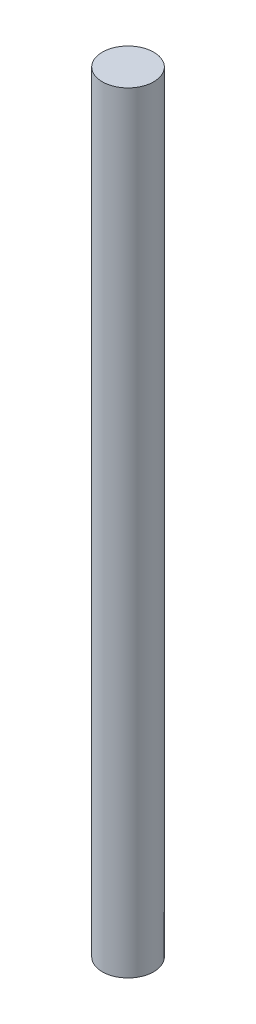
ISO-10303-21;
HEADER;
FILE_DESCRIPTION(('STEP AP214'),'2;1');
FILE_NAME('part.step','',(''),(''),'','','');
FILE_SCHEMA(('AUTOMOTIVE_DESIGN { 1 0 10303 214 1 1 1 1 }'));
ENDSEC;
DATA;
#1=APPLICATION_CONTEXT('core data for automotive mechanical design processes');
#2=APPLICATION_PROTOCOL_DEFINITION('international standard','automotive_design',2000,#1);
#3=PRODUCT_CONTEXT('',#1,'mechanical');
#4=PRODUCT('Part','Part','',(#3));
#5=PRODUCT_RELATED_PRODUCT_CATEGORY('part','',(#4));
#6=PRODUCT_DEFINITION_FORMATION('','',#4);
#7=PRODUCT_DEFINITION_CONTEXT('part definition',#1,'design');
#8=PRODUCT_DEFINITION('design','',#6,#7);
#9=PRODUCT_DEFINITION_SHAPE('','',#8);
#10=(LENGTH_UNIT() NAMED_UNIT(*) SI_UNIT(.MILLI.,.METRE.));
#11=(NAMED_UNIT(*) PLANE_ANGLE_UNIT() SI_UNIT($,.RADIAN.));
#12=(NAMED_UNIT(*) SI_UNIT($,.STERADIAN.) SOLID_ANGLE_UNIT());
#13=UNCERTAINTY_MEASURE_WITH_UNIT(LENGTH_MEASURE(1.E-05),#10,'distance_accuracy_value','');
#14=(GEOMETRIC_REPRESENTATION_CONTEXT(3) GLOBAL_UNCERTAINTY_ASSIGNED_CONTEXT((#13)) GLOBAL_UNIT_ASSIGNED_CONTEXT((#10,
#11,#12)) REPRESENTATION_CONTEXT('',''));
#15=CARTESIAN_POINT('',(0.,0.,0.));
#16=DIRECTION('',(0.,0.,1.));
#17=DIRECTION('',(1.,0.,0.));
#18=AXIS2_PLACEMENT_3D('',#15,#16,#17);
#19=CARTESIAN_POINT('',(0.,180.,0.));
#20=DIRECTION('',(0.,-1.,0.));
#21=DIRECTION('',(0.,0.,-1.));
#22=AXIS2_PLACEMENT_3D('',#19,#20,#21);
#23=CYLINDRICAL_SURFACE('',#22,6.);
#24=CARTESIAN_POINT('',(0.,180.,0.));
#25=DIRECTION('',(0.,1.,0.));
#26=DIRECTION('',(0.,0.,1.));
#27=AXIS2_PLACEMENT_3D('',#24,#25,#26);
#28=CIRCLE('',#27,6.);
#29=CARTESIAN_POINT('',(0.,180.,-6.));
#30=VERTEX_POINT('',#29);
#31=EDGE_CURVE('E10',#30,#30,#28,.T.);
#32=CARTESIAN_POINT('',(0.,0.,0.));
#33=DIRECTION('',(0.,1.,0.));
#34=DIRECTION('',(0.,0.,1.));
#35=AXIS2_PLACEMENT_3D('',#32,#33,#34);
#36=CIRCLE('',#35,6.);
#37=CARTESIAN_POINT('',(0.,0.,-6.));
#38=VERTEX_POINT('',#37);
#39=EDGE_CURVE('E40',#38,#38,#36,.T.);
#40=CARTESIAN_POINT('',(0.,180.,-6.));
#41=CARTESIAN_POINT('',(0.,178.125,-6.));
#42=CARTESIAN_POINT('',(0.,176.25,-6.));
#43=CARTESIAN_POINT('',(0.,172.5,-6.));
#44=CARTESIAN_POINT('',(0.,170.625,-6.));
#45=CARTESIAN_POINT('',(0.,166.875,-6.));
#46=CARTESIAN_POINT('',(0.,165.,-6.));
#47=CARTESIAN_POINT('',(0.,161.25,-6.));
#48=CARTESIAN_POINT('',(0.,159.375,-6.));
#49=CARTESIAN_POINT('',(0.,155.625,-6.));
#50=CARTESIAN_POINT('',(0.,153.75,-6.));
#51=CARTESIAN_POINT('',(0.,150.,-6.));
#52=CARTESIAN_POINT('',(0.,148.125,-6.));
#53=CARTESIAN_POINT('',(0.,144.375,-6.));
#54=CARTESIAN_POINT('',(0.,142.5,-6.));
#55=CARTESIAN_POINT('',(0.,138.75,-6.));
#56=CARTESIAN_POINT('',(0.,136.875,-6.));
#57=CARTESIAN_POINT('',(0.,133.125,-6.));
#58=CARTESIAN_POINT('',(0.,131.25,-6.));
#59=CARTESIAN_POINT('',(0.,127.5,-6.));
#60=CARTESIAN_POINT('',(0.,125.625,-6.));
#61=CARTESIAN_POINT('',(0.,121.875,-6.));
#62=CARTESIAN_POINT('',(0.,120.,-6.));
#63=CARTESIAN_POINT('',(0.,116.25,-6.));
#64=CARTESIAN_POINT('',(0.,114.375,-6.));
#65=CARTESIAN_POINT('',(0.,110.625,-6.));
#66=CARTESIAN_POINT('',(0.,108.75,-6.));
#67=CARTESIAN_POINT('',(0.,105.,-6.));
#68=CARTESIAN_POINT('',(0.,103.125,-6.));
#69=CARTESIAN_POINT('',(0.,99.375,-6.));
#70=CARTESIAN_POINT('',(0.,97.5,-6.));
#71=CARTESIAN_POINT('',(0.,93.75,-6.));
#72=CARTESIAN_POINT('',(0.,91.875,-6.));
#73=CARTESIAN_POINT('',(0.,88.125,-6.));
#74=CARTESIAN_POINT('',(0.,86.25,-6.));
#75=CARTESIAN_POINT('',(0.,82.5,-6.));
#76=CARTESIAN_POINT('',(0.,80.625,-6.));
#77=CARTESIAN_POINT('',(0.,76.875,-6.));
#78=CARTESIAN_POINT('',(0.,75.,-6.));
#79=CARTESIAN_POINT('',(0.,71.25,-6.));
#80=CARTESIAN_POINT('',(0.,69.375,-6.));
#81=CARTESIAN_POINT('',(0.,65.625,-6.));
#82=CARTESIAN_POINT('',(0.,63.75,-6.));
#83=CARTESIAN_POINT('',(0.,60.,-6.));
#84=CARTESIAN_POINT('',(0.,58.125,-6.));
#85=CARTESIAN_POINT('',(0.,54.375,-6.));
#86=CARTESIAN_POINT('',(0.,52.5,-6.));
#87=CARTESIAN_POINT('',(0.,48.75,-6.));
#88=CARTESIAN_POINT('',(0.,46.875,-6.));
#89=CARTESIAN_POINT('',(0.,43.125,-6.));
#90=CARTESIAN_POINT('',(0.,41.25,-6.));
#91=CARTESIAN_POINT('',(0.,37.5,-6.));
#92=CARTESIAN_POINT('',(0.,35.625,-6.));
#93=CARTESIAN_POINT('',(0.,31.875,-6.));
#94=CARTESIAN_POINT('',(0.,30.,-6.));
#95=CARTESIAN_POINT('',(0.,26.25,-6.));
#96=CARTESIAN_POINT('',(0.,24.375,-6.));
#97=CARTESIAN_POINT('',(0.,20.625,-6.));
#98=CARTESIAN_POINT('',(0.,18.75,-6.));
#99=CARTESIAN_POINT('',(0.,15.,-6.));
#100=CARTESIAN_POINT('',(0.,13.125,-6.));
#101=CARTESIAN_POINT('',(0.,9.37499999999998,-6.));
#102=CARTESIAN_POINT('',(0.,7.49999999999997,-6.));
#103=CARTESIAN_POINT('',(0.,3.74999999999997,-6.));
#104=CARTESIAN_POINT('',(0.,1.87499999999997,-6.));
#105=CARTESIAN_POINT('',(0.,0.,-6.));
#106=B_SPLINE_CURVE_WITH_KNOTS('',3,(#40,#41,#42,#43,#44,#45,#46,#47,#48,#49,#50,#51,#52,#53,
#54,#55,#56,#57,#58,#59,#60,#61,#62,#63,#64,#65,#66,#67,#68,#69,#70,#71,#72,#73,#74,#75,#76,#77,
#78,#79,#80,#81,#82,#83,#84,#85,#86,#87,#88,#89,#90,#91,#92,#93,#94,#95,#96,#97,#98,#99,#100,
#101,#102,#103,#104,#105),.UNSPECIFIED.,.F.,.F.,(4,2,2,2,2,2,2,2,2,2,2,2,2,2,2,2,2,2,2,2,2,2,2,
2,2,2,2,2,2,2,2,2,4),(0.,5.62499999999999,11.25,16.875,22.5,28.125,33.75,39.375,45.,50.625,
56.25,61.875,67.5,73.125,78.75,84.375,90.,95.625,101.25,106.875,112.5,118.125,123.75,129.375,
135.,140.625,146.25,151.875,157.5,163.125,168.75,174.375,180.),.UNSPECIFIED.);
#107=EDGE_CURVE('BSEAM37',#30,#38,#106,.T.);
#108=ORIENTED_EDGE('',*,*,#31,.F.);
#109=ORIENTED_EDGE('',*,*,#39,.T.);
#110=ORIENTED_EDGE('',*,*,#107,.T.);
#111=ORIENTED_EDGE('',*,*,#107,.F.);
#112=EDGE_LOOP('',(#108,#110,#109,#111));
#113=FACE_BOUND('',#112,.T.);
#114=ADVANCED_FACE('F37',(#113),#23,.T.);
#115=CARTESIAN_POINT('',(0.,180.,0.));
#116=DIRECTION('',(0.,1.,0.));
#117=DIRECTION('',(0.,0.,1.));
#118=AXIS2_PLACEMENT_3D('',#115,#116,#117);
#119=PLANE('',#118);
#120=ORIENTED_EDGE('',*,*,#31,.T.);
#121=EDGE_LOOP('',(#120));
#122=FACE_BOUND('',#121,.T.);
#123=ADVANCED_FACE('F54',(#122),#119,.T.);
#124=CARTESIAN_POINT('',(0.,0.,0.));
#125=DIRECTION('',(0.,1.,0.));
#126=DIRECTION('',(0.,0.,1.));
#127=AXIS2_PLACEMENT_3D('',#124,#125,#126);
#128=PLANE('',#127);
#129=ORIENTED_EDGE('',*,*,#39,.F.);
#130=EDGE_LOOP('',(#129));
#131=FACE_BOUND('',#130,.T.);
#132=ADVANCED_FACE('F52',(#131),#128,.F.);
#133=CLOSED_SHELL('',(#114,#123,#132));
#134=MANIFOLD_SOLID_BREP('B2',#133);
#135=ADVANCED_BREP_SHAPE_REPRESENTATION('',(#18,#134),#14);
#136=SHAPE_DEFINITION_REPRESENTATION(#9,#135);
ENDSEC;
END-ISO-10303-21;
